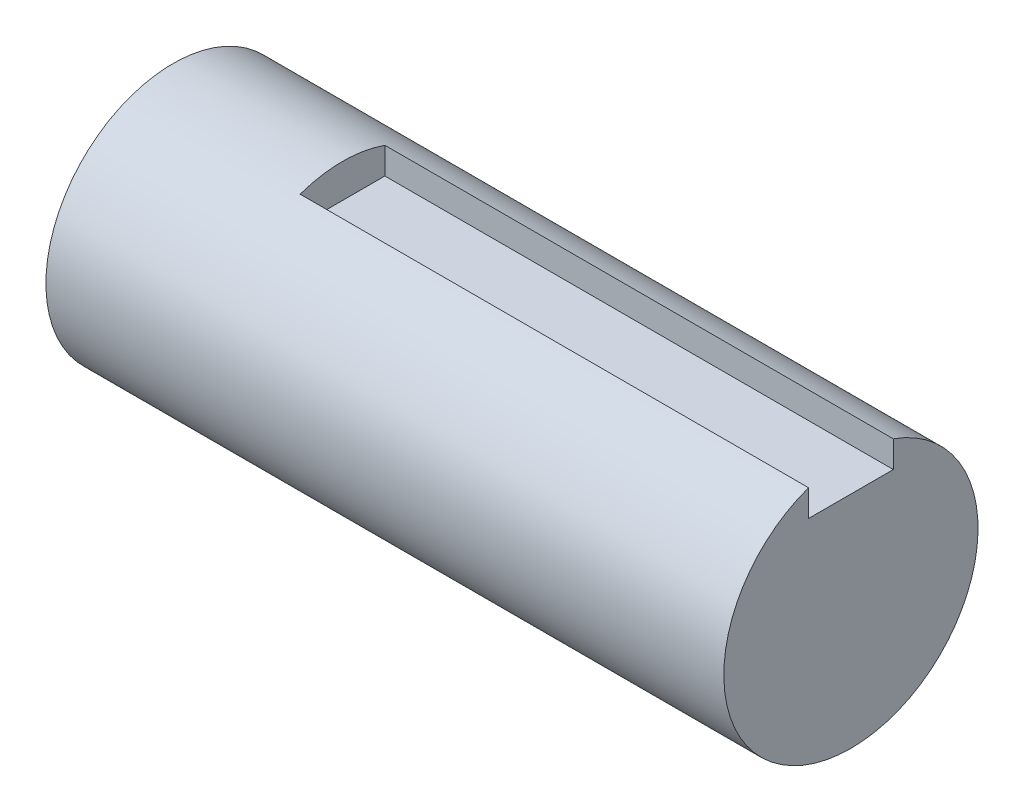
ISO-10303-21;
HEADER;
FILE_DESCRIPTION(('STEP AP214'),'2;1');
FILE_NAME('part.step','',(''),(''),'','','');
FILE_SCHEMA(('AUTOMOTIVE_DESIGN { 1 0 10303 214 1 1 1 1 }'));
ENDSEC;
DATA;
#1=APPLICATION_CONTEXT('core data for automotive mechanical design processes');
#2=APPLICATION_PROTOCOL_DEFINITION('international standard','automotive_design',2000,#1);
#3=PRODUCT_CONTEXT('',#1,'mechanical');
#4=PRODUCT('Part','Part','',(#3));
#5=PRODUCT_RELATED_PRODUCT_CATEGORY('part','',(#4));
#6=PRODUCT_DEFINITION_FORMATION('','',#4);
#7=PRODUCT_DEFINITION_CONTEXT('part definition',#1,'design');
#8=PRODUCT_DEFINITION('design','',#6,#7);
#9=PRODUCT_DEFINITION_SHAPE('','',#8);
#10=(LENGTH_UNIT() NAMED_UNIT(*) SI_UNIT(.MILLI.,.METRE.));
#11=(NAMED_UNIT(*) PLANE_ANGLE_UNIT() SI_UNIT($,.RADIAN.));
#12=(NAMED_UNIT(*) SI_UNIT($,.STERADIAN.) SOLID_ANGLE_UNIT());
#13=UNCERTAINTY_MEASURE_WITH_UNIT(LENGTH_MEASURE(1.E-05),#10,'distance_accuracy_value','');
#14=(GEOMETRIC_REPRESENTATION_CONTEXT(3) GLOBAL_UNCERTAINTY_ASSIGNED_CONTEXT((#13)) GLOBAL_UNIT_ASSIGNED_CONTEXT((#10,
#11,#12)) REPRESENTATION_CONTEXT('',''));
#15=CARTESIAN_POINT('',(0.,0.,0.));
#16=DIRECTION('',(0.,0.,1.));
#17=DIRECTION('',(1.,0.,0.));
#18=AXIS2_PLACEMENT_3D('',#15,#16,#17);
#19=CARTESIAN_POINT('',(80.,0.,0.));
#20=DIRECTION('',(-1.,0.,0.));
#21=DIRECTION('',(0.,0.,1.));
#22=AXIS2_PLACEMENT_3D('',#19,#20,#21);
#23=CYLINDRICAL_SURFACE('',#22,15.);
#24=CARTESIAN_POINT('',(0.,0.,0.));
#25=DIRECTION('',(1.,0.,0.));
#26=DIRECTION('',(0.,0.,-1.));
#27=AXIS2_PLACEMENT_3D('',#24,#25,#26);
#28=CIRCLE('',#27,15.);
#29=CARTESIAN_POINT('',(0.,0.,-15.));
#30=VERTEX_POINT('',#29);
#31=EDGE_CURVE('E44',#30,#30,#28,.T.);
#32=ORIENTED_EDGE('',*,*,#31,.T.);
#33=EDGE_LOOP('',(#32));
#34=FACE_BOUND('',#33,.T.);
#35=DIRECTION('',(1.,0.,0.));
#36=VECTOR('',#35,1.);
#37=CARTESIAN_POINT('',(20.,14.1421356237309,-5.));
#38=LINE('',#37,#36);
#39=CARTESIAN_POINT('',(20.,14.1421356237309,-5.));
#40=VERTEX_POINT('',#39);
#41=CARTESIAN_POINT('',(80.,14.1421356237309,-5.));
#42=VERTEX_POINT('',#41);
#43=EDGE_CURVE('E83',#40,#42,#38,.T.);
#44=ORIENTED_EDGE('',*,*,#43,.T.);
#45=CARTESIAN_POINT('',(80.,0.,0.));
#46=DIRECTION('',(1.,0.,0.));
#47=DIRECTION('',(0.,0.,-1.));
#48=AXIS2_PLACEMENT_3D('',#45,#46,#47);
#49=CIRCLE('',#48,15.);
#50=CARTESIAN_POINT('',(80.,14.1421356237309,5.));
#51=VERTEX_POINT('',#50);
#52=EDGE_CURVE('E11',#51,#42,#49,.T.);
#53=ORIENTED_EDGE('',*,*,#52,.F.);
#54=DIRECTION('',(1.,0.,0.));
#55=VECTOR('',#54,1.);
#56=CARTESIAN_POINT('',(20.,14.142135623731,5.));
#57=LINE('',#56,#55);
#58=CARTESIAN_POINT('',(20.,14.142135623731,5.));
#59=VERTEX_POINT('',#58);
#60=EDGE_CURVE('E56',#59,#51,#57,.T.);
#61=ORIENTED_EDGE('',*,*,#60,.F.);
#62=CARTESIAN_POINT('',(20.,0.,0.));
#63=DIRECTION('',(1.,0.,0.));
#64=DIRECTION('',(0.,0.,-1.));
#65=AXIS2_PLACEMENT_3D('',#62,#63,#64);
#66=CIRCLE('',#65,15.);
#67=EDGE_CURVE('E94',#40,#59,#66,.T.);
#68=ORIENTED_EDGE('',*,*,#67,.F.);
#69=EDGE_LOOP('',(#44,#53,#61,#68));
#70=FACE_BOUND('',#69,.T.);
#71=ADVANCED_FACE('F41',(#34,#70),#23,.T.);
#72=CARTESIAN_POINT('',(80.,0.,0.));
#73=DIRECTION('',(1.,0.,0.));
#74=DIRECTION('',(0.,0.,-1.));
#75=AXIS2_PLACEMENT_3D('',#72,#73,#74);
#76=PLANE('',#75);
#77=ORIENTED_EDGE('',*,*,#52,.T.);
#78=DIRECTION('',(0.,-1.,0.));
#79=VECTOR('',#78,1.);
#80=CARTESIAN_POINT('',(80.,0.,-5.00000000000001));
#81=LINE('',#80,#79);
#82=CARTESIAN_POINT('',(80.,11.,-5.));
#83=VERTEX_POINT('',#82);
#84=EDGE_CURVE('E117',#42,#83,#81,.T.);
#85=ORIENTED_EDGE('',*,*,#84,.T.);
#86=DIRECTION('',(0.,0.,-1.));
#87=VECTOR('',#86,1.);
#88=CARTESIAN_POINT('',(80.,11.,0.));
#89=LINE('',#88,#87);
#90=CARTESIAN_POINT('',(80.,11.,5.));
#91=VERTEX_POINT('',#90);
#92=EDGE_CURVE('E111',#91,#83,#89,.T.);
#93=ORIENTED_EDGE('',*,*,#92,.F.);
#94=DIRECTION('',(0.,-1.,0.));
#95=VECTOR('',#94,1.);
#96=CARTESIAN_POINT('',(80.,0.,4.99999999999999));
#97=LINE('',#96,#95);
#98=EDGE_CURVE('E114',#51,#91,#97,.T.);
#99=ORIENTED_EDGE('',*,*,#98,.F.);
#100=EDGE_LOOP('',(#77,#85,#93,#99));
#101=FACE_BOUND('',#100,.T.);
#102=ADVANCED_FACE('F128',(#101),#76,.T.);
#103=CARTESIAN_POINT('',(0.,0.,0.));
#104=DIRECTION('',(1.,0.,0.));
#105=DIRECTION('',(0.,0.,-1.));
#106=AXIS2_PLACEMENT_3D('',#103,#104,#105);
#107=PLANE('',#106);
#108=ORIENTED_EDGE('',*,*,#31,.F.);
#109=EDGE_LOOP('',(#108));
#110=FACE_BOUND('',#109,.T.);
#111=ADVANCED_FACE('F131',(#110),#107,.F.);
#112=CARTESIAN_POINT('',(20.,0.,-5.00000000000001));
#113=DIRECTION('',(0.,0.,1.));
#114=DIRECTION('',(0.,-1.,0.));
#115=AXIS2_PLACEMENT_3D('',#112,#113,#114);
#116=PLANE('',#115);
#117=ORIENTED_EDGE('',*,*,#84,.F.);
#118=ORIENTED_EDGE('',*,*,#43,.F.);
#119=DIRECTION('',(0.,-1.,0.));
#120=VECTOR('',#119,1.);
#121=CARTESIAN_POINT('',(20.,0.,-5.00000000000001));
#122=LINE('',#121,#120);
#123=CARTESIAN_POINT('',(20.,11.,-5.));
#124=VERTEX_POINT('',#123);
#125=EDGE_CURVE('E65',#40,#124,#122,.T.);
#126=ORIENTED_EDGE('',*,*,#125,.T.);
#127=DIRECTION('',(1.,0.,0.));
#128=VECTOR('',#127,1.);
#129=CARTESIAN_POINT('',(20.,11.,-5.));
#130=LINE('',#129,#128);
#131=EDGE_CURVE('E79',#124,#83,#130,.T.);
#132=ORIENTED_EDGE('',*,*,#131,.T.);
#133=EDGE_LOOP('',(#117,#118,#126,#132));
#134=FACE_BOUND('',#133,.T.);
#135=ADVANCED_FACE('F129',(#134),#116,.T.);
#136=CARTESIAN_POINT('',(20.,11.,0.));
#137=DIRECTION('',(0.,-1.,0.));
#138=DIRECTION('',(0.,0.,-1.));
#139=AXIS2_PLACEMENT_3D('',#136,#137,#138);
#140=PLANE('',#139);
#141=ORIENTED_EDGE('',*,*,#92,.T.);
#142=ORIENTED_EDGE('',*,*,#131,.F.);
#143=DIRECTION('',(0.,0.,-1.));
#144=VECTOR('',#143,1.);
#145=CARTESIAN_POINT('',(20.,11.,0.));
#146=LINE('',#145,#144);
#147=CARTESIAN_POINT('',(20.,11.,5.));
#148=VERTEX_POINT('',#147);
#149=EDGE_CURVE('E93',#148,#124,#146,.T.);
#150=ORIENTED_EDGE('',*,*,#149,.F.);
#151=DIRECTION('',(1.,0.,0.));
#152=VECTOR('',#151,1.);
#153=CARTESIAN_POINT('',(20.,11.,5.));
#154=LINE('',#153,#152);
#155=EDGE_CURVE('E88',#148,#91,#154,.T.);
#156=ORIENTED_EDGE('',*,*,#155,.T.);
#157=EDGE_LOOP('',(#141,#142,#150,#156));
#158=FACE_BOUND('',#157,.T.);
#159=ADVANCED_FACE('F125',(#158),#140,.F.);
#160=CARTESIAN_POINT('',(20.,0.,4.99999999999999));
#161=DIRECTION('',(0.,0.,1.));
#162=DIRECTION('',(0.,-1.,0.));
#163=AXIS2_PLACEMENT_3D('',#160,#161,#162);
#164=PLANE('',#163);
#165=ORIENTED_EDGE('',*,*,#98,.T.);
#166=ORIENTED_EDGE('',*,*,#155,.F.);
#167=DIRECTION('',(0.,-1.,0.));
#168=VECTOR('',#167,1.);
#169=CARTESIAN_POINT('',(20.,0.,4.99999999999999));
#170=LINE('',#169,#168);
#171=EDGE_CURVE('E85',#59,#148,#170,.T.);
#172=ORIENTED_EDGE('',*,*,#171,.F.);
#173=ORIENTED_EDGE('',*,*,#60,.T.);
#174=EDGE_LOOP('',(#165,#166,#172,#173));
#175=FACE_BOUND('',#174,.T.);
#176=ADVANCED_FACE('F87',(#175),#164,.F.);
#177=CARTESIAN_POINT('',(20.,0.,0.));
#178=DIRECTION('',(1.,0.,0.));
#179=DIRECTION('',(0.,0.,-1.));
#180=AXIS2_PLACEMENT_3D('',#177,#178,#179);
#181=PLANE('',#180);
#182=ORIENTED_EDGE('',*,*,#125,.F.);
#183=ORIENTED_EDGE('',*,*,#67,.T.);
#184=ORIENTED_EDGE('',*,*,#171,.T.);
#185=ORIENTED_EDGE('',*,*,#149,.T.);
#186=EDGE_LOOP('',(#182,#183,#184,#185));
#187=FACE_BOUND('',#186,.T.);
#188=ADVANCED_FACE('F97',(#187),#181,.T.);
#189=CLOSED_SHELL('',(#71,#102,#111,#135,#159,#176,#188));
#190=MANIFOLD_SOLID_BREP('B2',#189);
#191=ADVANCED_BREP_SHAPE_REPRESENTATION('',(#18,#190),#14);
#192=SHAPE_DEFINITION_REPRESENTATION(#9,#191);
ENDSEC;
END-ISO-10303-21;
